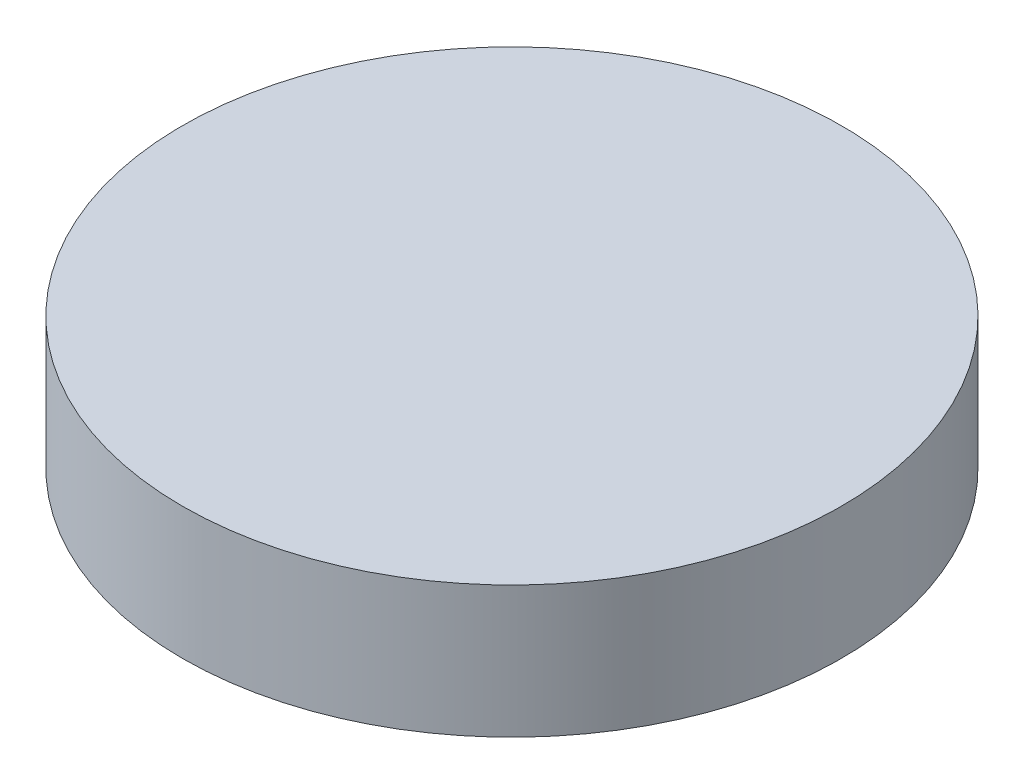
ISO-10303-21;
HEADER;
FILE_DESCRIPTION(('STEP AP214'),'2;1');
FILE_NAME('part.step','',(''),(''),'','','');
FILE_SCHEMA(('AUTOMOTIVE_DESIGN { 1 0 10303 214 1 1 1 1 }'));
ENDSEC;
DATA;
#1=APPLICATION_CONTEXT('core data for automotive mechanical design processes');
#2=APPLICATION_PROTOCOL_DEFINITION('international standard','automotive_design',2000,#1);
#3=PRODUCT_CONTEXT('',#1,'mechanical');
#4=PRODUCT('Part','Part','',(#3));
#5=PRODUCT_RELATED_PRODUCT_CATEGORY('part','',(#4));
#6=PRODUCT_DEFINITION_FORMATION('','',#4);
#7=PRODUCT_DEFINITION_CONTEXT('part definition',#1,'design');
#8=PRODUCT_DEFINITION('design','',#6,#7);
#9=PRODUCT_DEFINITION_SHAPE('','',#8);
#10=(LENGTH_UNIT() NAMED_UNIT(*) SI_UNIT(.MILLI.,.METRE.));
#11=(NAMED_UNIT(*) PLANE_ANGLE_UNIT() SI_UNIT($,.RADIAN.));
#12=(NAMED_UNIT(*) SI_UNIT($,.STERADIAN.) SOLID_ANGLE_UNIT());
#13=UNCERTAINTY_MEASURE_WITH_UNIT(LENGTH_MEASURE(1.E-05),#10,'distance_accuracy_value','');
#14=(GEOMETRIC_REPRESENTATION_CONTEXT(3) GLOBAL_UNCERTAINTY_ASSIGNED_CONTEXT((#13)) GLOBAL_UNIT_ASSIGNED_CONTEXT((#10,
#11,#12)) REPRESENTATION_CONTEXT('',''));
#15=CARTESIAN_POINT('',(0.,0.,0.));
#16=DIRECTION('',(0.,0.,1.));
#17=DIRECTION('',(1.,0.,0.));
#18=AXIS2_PLACEMENT_3D('',#15,#16,#17);
#19=CARTESIAN_POINT('',(0.,1.27,0.));
#20=DIRECTION('',(0.,-1.,0.));
#21=DIRECTION('',(0.,0.,-1.));
#22=AXIS2_PLACEMENT_3D('',#19,#20,#21);
#23=CYLINDRICAL_SURFACE('',#22,3.175);
#24=CARTESIAN_POINT('',(0.,1.27,0.));
#25=DIRECTION('',(0.,1.,0.));
#26=DIRECTION('',(0.,0.,1.));
#27=AXIS2_PLACEMENT_3D('',#24,#25,#26);
#28=CIRCLE('',#27,3.175);
#29=CARTESIAN_POINT('',(0.,1.27,3.175));
#30=VERTEX_POINT('',#29);
#31=EDGE_CURVE('E10',#30,#30,#28,.T.);
#32=ORIENTED_EDGE('',*,*,#31,.F.);
#33=EDGE_LOOP('',(#32));
#34=FACE_BOUND('',#33,.T.);
#35=CARTESIAN_POINT('',(0.,0.,0.));
#36=DIRECTION('',(0.,1.,0.));
#37=DIRECTION('',(0.,0.,1.));
#38=AXIS2_PLACEMENT_3D('',#35,#36,#37);
#39=CIRCLE('',#38,3.175);
#40=CARTESIAN_POINT('',(0.,0.,3.175));
#41=VERTEX_POINT('',#40);
#42=EDGE_CURVE('E34',#41,#41,#39,.T.);
#43=ORIENTED_EDGE('',*,*,#42,.T.);
#44=EDGE_LOOP('',(#43));
#45=FACE_BOUND('',#44,.T.);
#46=ADVANCED_FACE('F31',(#34,#45),#23,.T.);
#47=CARTESIAN_POINT('',(0.,1.27,0.));
#48=DIRECTION('',(0.,1.,0.));
#49=DIRECTION('',(0.,0.,1.));
#50=AXIS2_PLACEMENT_3D('',#47,#48,#49);
#51=PLANE('',#50);
#52=ORIENTED_EDGE('',*,*,#31,.T.);
#53=EDGE_LOOP('',(#52));
#54=FACE_BOUND('',#53,.T.);
#55=ADVANCED_FACE('F46',(#54),#51,.T.);
#56=CARTESIAN_POINT('',(0.,0.,0.));
#57=DIRECTION('',(0.,1.,0.));
#58=DIRECTION('',(0.,0.,1.));
#59=AXIS2_PLACEMENT_3D('',#56,#57,#58);
#60=PLANE('',#59);
#61=ORIENTED_EDGE('',*,*,#42,.F.);
#62=EDGE_LOOP('',(#61));
#63=FACE_BOUND('',#62,.T.);
#64=ADVANCED_FACE('F44',(#63),#60,.F.);
#65=CLOSED_SHELL('',(#46,#55,#64));
#66=MANIFOLD_SOLID_BREP('B2',#65);
#67=ADVANCED_BREP_SHAPE_REPRESENTATION('',(#18,#66),#14);
#68=SHAPE_DEFINITION_REPRESENTATION(#9,#67);
ENDSEC;
END-ISO-10303-21;
